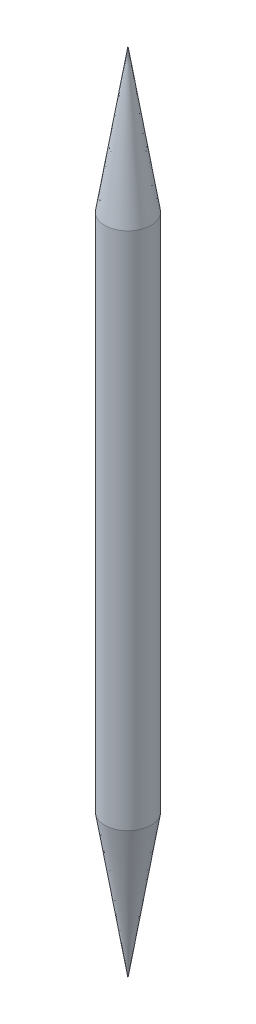
ISO-10303-21;
HEADER;
FILE_DESCRIPTION(('STEP AP214'),'2;1');
FILE_NAME('part.step','',(''),(''),'','','');
FILE_SCHEMA(('AUTOMOTIVE_DESIGN { 1 0 10303 214 1 1 1 1 }'));
ENDSEC;
DATA;
#1=APPLICATION_CONTEXT('core data for automotive mechanical design processes');
#2=APPLICATION_PROTOCOL_DEFINITION('international standard','automotive_design',2000,#1);
#3=PRODUCT_CONTEXT('',#1,'mechanical');
#4=PRODUCT('Part','Part','',(#3));
#5=PRODUCT_RELATED_PRODUCT_CATEGORY('part','',(#4));
#6=PRODUCT_DEFINITION_FORMATION('','',#4);
#7=PRODUCT_DEFINITION_CONTEXT('part definition',#1,'design');
#8=PRODUCT_DEFINITION('design','',#6,#7);
#9=PRODUCT_DEFINITION_SHAPE('','',#8);
#10=(LENGTH_UNIT() NAMED_UNIT(*) SI_UNIT(.MILLI.,.METRE.));
#11=(NAMED_UNIT(*) PLANE_ANGLE_UNIT() SI_UNIT($,.RADIAN.));
#12=(NAMED_UNIT(*) SI_UNIT($,.STERADIAN.) SOLID_ANGLE_UNIT());
#13=UNCERTAINTY_MEASURE_WITH_UNIT(LENGTH_MEASURE(1.E-05),#10,'distance_accuracy_value','');
#14=(GEOMETRIC_REPRESENTATION_CONTEXT(3) GLOBAL_UNCERTAINTY_ASSIGNED_CONTEXT((#13)) GLOBAL_UNIT_ASSIGNED_CONTEXT((#10,
#11,#12)) REPRESENTATION_CONTEXT('',''));
#15=CARTESIAN_POINT('',(0.,0.,0.));
#16=DIRECTION('',(0.,0.,1.));
#17=DIRECTION('',(1.,0.,0.));
#18=AXIS2_PLACEMENT_3D('',#15,#16,#17);
#19=CARTESIAN_POINT('',(0.,1000.,0.));
#20=DIRECTION('',(0.,-1.,0.));
#21=DIRECTION('',(0.,0.,-1.));
#22=AXIS2_PLACEMENT_3D('',#19,#20,#21);
#23=CYLINDRICAL_SURFACE('',#22,44.45);
#24=CARTESIAN_POINT('',(0.,1000.,0.));
#25=DIRECTION('',(0.,1.,0.));
#26=DIRECTION('',(0.,0.,1.));
#27=AXIS2_PLACEMENT_3D('',#24,#25,#26);
#28=CIRCLE('',#27,44.45);
#29=CARTESIAN_POINT('',(0.,1000.,44.45));
#30=VERTEX_POINT('',#29);
#31=EDGE_CURVE('E11',#30,#30,#28,.T.);
#32=ORIENTED_EDGE('',*,*,#31,.F.);
#33=EDGE_LOOP('',(#32));
#34=FACE_BOUND('',#33,.T.);
#35=CARTESIAN_POINT('',(0.,0.,0.));
#36=DIRECTION('',(0.,1.,0.));
#37=DIRECTION('',(-1.,0.,0.));
#38=AXIS2_PLACEMENT_3D('',#35,#36,#37);
#39=CIRCLE('',#38,44.45);
#40=CARTESIAN_POINT('',(-44.45,0.,0.));
#41=VERTEX_POINT('',#40);
#42=EDGE_CURVE('E47',#41,#41,#39,.T.);
#43=ORIENTED_EDGE('',*,*,#42,.T.);
#44=EDGE_LOOP('',(#43));
#45=FACE_BOUND('',#44,.T.);
#46=ADVANCED_FACE('F39',(#34,#45),#23,.T.);
#47=CARTESIAN_POINT('',(0.,1276.86,0.));
#48=DIRECTION('',(0.,-1.,0.));
#49=DIRECTION('',(0.,0.,-1.));
#50=AXIS2_PLACEMENT_3D('',#47,#48,#49);
#51=CONICAL_SURFACE('',#50,0.,0.159191934764573);
#52=ORIENTED_EDGE('',*,*,#31,.T.);
#53=EDGE_LOOP('',(#52));
#54=FACE_BOUND('',#53,.T.);
#55=CARTESIAN_POINT('',(0.,1276.86,0.));
#56=VERTEX_POINT('',#55);
#57=VERTEX_LOOP('',#56);
#58=FACE_BOUND('',#57,.T.);
#59=ADVANCED_FACE('F56',(#54,#58),#51,.T.);
#60=CARTESIAN_POINT('',(0.,0.,0.));
#61=DIRECTION('',(0.,1.,0.));
#62=DIRECTION('',(-1.,0.,0.));
#63=AXIS2_PLACEMENT_3D('',#60,#61,#62);
#64=CONICAL_SURFACE('',#63,44.45,0.159191934764574);
#65=CARTESIAN_POINT('',(0.,-276.86,0.));
#66=VERTEX_POINT('',#65);
#67=VERTEX_LOOP('',#66);
#68=FACE_BOUND('',#67,.T.);
#69=ORIENTED_EDGE('',*,*,#42,.F.);
#70=EDGE_LOOP('',(#69));
#71=FACE_BOUND('',#70,.T.);
#72=ADVANCED_FACE('F53',(#68,#71),#64,.T.);
#73=CLOSED_SHELL('',(#46,#59,#72));
#74=MANIFOLD_SOLID_BREP('B2',#73);
#75=ADVANCED_BREP_SHAPE_REPRESENTATION('',(#18,#74),#14);
#76=SHAPE_DEFINITION_REPRESENTATION(#9,#75);
ENDSEC;
END-ISO-10303-21;
